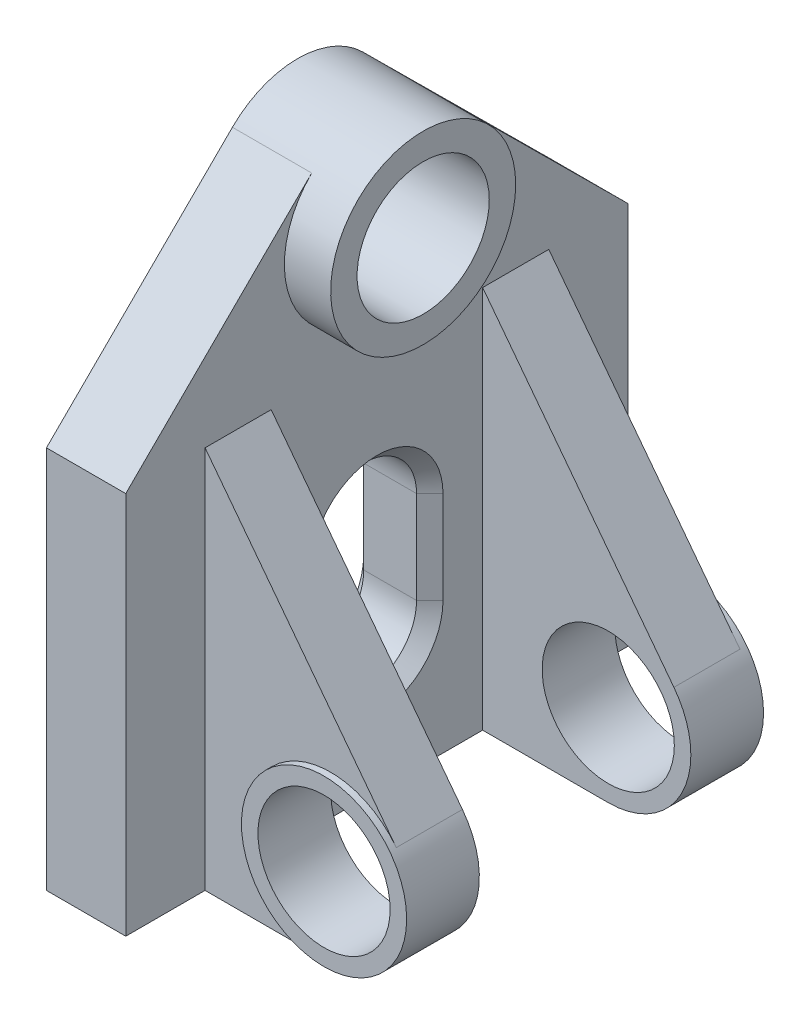
ISO-10303-21;
HEADER;
FILE_DESCRIPTION(('STEP AP214'),'2;1');
FILE_NAME('part.step','',(''),(''),'','','');
FILE_SCHEMA(('AUTOMOTIVE_DESIGN { 1 0 10303 214 1 1 1 1 }'));
ENDSEC;
DATA;
#1=APPLICATION_CONTEXT('core data for automotive mechanical design processes');
#2=APPLICATION_PROTOCOL_DEFINITION('international standard','automotive_design',2000,#1);
#3=PRODUCT_CONTEXT('',#1,'mechanical');
#4=PRODUCT('Part','Part','',(#3));
#5=PRODUCT_RELATED_PRODUCT_CATEGORY('part','',(#4));
#6=PRODUCT_DEFINITION_FORMATION('','',#4);
#7=PRODUCT_DEFINITION_CONTEXT('part definition',#1,'design');
#8=PRODUCT_DEFINITION('design','',#6,#7);
#9=PRODUCT_DEFINITION_SHAPE('','',#8);
#10=(LENGTH_UNIT() NAMED_UNIT(*) SI_UNIT(.MILLI.,.METRE.));
#11=(NAMED_UNIT(*) PLANE_ANGLE_UNIT() SI_UNIT($,.RADIAN.));
#12=(NAMED_UNIT(*) SI_UNIT($,.STERADIAN.) SOLID_ANGLE_UNIT());
#13=UNCERTAINTY_MEASURE_WITH_UNIT(LENGTH_MEASURE(1.E-05),#10,'distance_accuracy_value','');
#14=(GEOMETRIC_REPRESENTATION_CONTEXT(3) GLOBAL_UNCERTAINTY_ASSIGNED_CONTEXT((#13)) GLOBAL_UNIT_ASSIGNED_CONTEXT((#10,
#11,#12)) REPRESENTATION_CONTEXT('',''));
#15=CARTESIAN_POINT('',(0.,0.,0.));
#16=DIRECTION('',(0.,0.,1.));
#17=DIRECTION('',(1.,0.,0.));
#18=AXIS2_PLACEMENT_3D('',#15,#16,#17);
#19=CARTESIAN_POINT('',(12.,48.2075654717853,47.8629421342849));
#20=DIRECTION('',(0.,0.709638743055161,0.70456572039455));
#21=DIRECTION('',(0.,-0.70456572039455,0.709638743055161));
#22=AXIS2_PLACEMENT_3D('',#19,#20,#21);
#23=PLANE('',#22);
#24=DIRECTION('',(0.,0.70456572039455,-0.709638743055161));
#25=VECTOR('',#24,1.);
#26=CARTESIAN_POINT('',(0.,48.2075654717853,47.8629421342849));
#27=LINE('',#26,#25);
#28=CARTESIAN_POINT('',(0.,58.,38.));
#29=VERTEX_POINT('',#28);
#30=CARTESIAN_POINT('',(0.,85.9349424027723,9.8639200855237));
#31=VERTEX_POINT('',#30);
#32=EDGE_CURVE('E328',#29,#31,#27,.T.);
#33=ORIENTED_EDGE('',*,*,#32,.F.);
#34=DIRECTION('',(-1.,0.,0.));
#35=VECTOR('',#34,1.);
#36=CARTESIAN_POINT('',(12.,58.,38.));
#37=LINE('',#36,#35);
#38=CARTESIAN_POINT('',(12.,58.,38.));
#39=VERTEX_POINT('',#38);
#40=EDGE_CURVE('E394',#39,#29,#37,.T.);
#41=ORIENTED_EDGE('',*,*,#40,.F.);
#42=DIRECTION('',(0.,0.70456572039455,-0.709638743055161));
#43=VECTOR('',#42,1.);
#44=CARTESIAN_POINT('',(12.,48.2075654717853,47.8629421342849));
#45=LINE('',#44,#43);
#46=CARTESIAN_POINT('',(12.,85.9349424027723,9.8639200855237));
#47=VERTEX_POINT('',#46);
#48=EDGE_CURVE('E337',#39,#47,#45,.T.);
#49=ORIENTED_EDGE('',*,*,#48,.T.);
#50=DIRECTION('',(-1.,0.,0.));
#51=VECTOR('',#50,1.);
#52=CARTESIAN_POINT('',(12.,85.9349424027723,9.86392008552369));
#53=LINE('',#52,#51);
#54=EDGE_CURVE('E397',#47,#31,#53,.T.);
#55=ORIENTED_EDGE('',*,*,#54,.T.);
#56=EDGE_LOOP('',(#33,#41,#49,#55));
#57=FACE_BOUND('',#56,.T.);
#58=ADVANCED_FACE('F47',(#57),#23,.T.);
#59=CARTESIAN_POINT('',(12.,0.,38.));
#60=DIRECTION('',(0.,0.,1.));
#61=DIRECTION('',(1.,0.,0.));
#62=AXIS2_PLACEMENT_3D('',#59,#60,#61);
#63=PLANE('',#62);
#64=DIRECTION('',(0.,1.,0.));
#65=VECTOR('',#64,1.);
#66=CARTESIAN_POINT('',(0.,0.,38.));
#67=LINE('',#66,#65);
#68=CARTESIAN_POINT('',(0.,0.,38.));
#69=VERTEX_POINT('',#68);
#70=EDGE_CURVE('E364',#69,#29,#67,.T.);
#71=ORIENTED_EDGE('',*,*,#70,.F.);
#72=DIRECTION('',(-1.,0.,0.));
#73=VECTOR('',#72,1.);
#74=CARTESIAN_POINT('',(12.,0.,38.));
#75=LINE('',#74,#73);
#76=CARTESIAN_POINT('',(12.,0.,38.));
#77=VERTEX_POINT('',#76);
#78=EDGE_CURVE('E391',#77,#69,#75,.T.);
#79=ORIENTED_EDGE('',*,*,#78,.F.);
#80=DIRECTION('',(0.,1.,0.));
#81=VECTOR('',#80,1.);
#82=CARTESIAN_POINT('',(12.,0.,38.));
#83=LINE('',#82,#81);
#84=EDGE_CURVE('E342',#77,#39,#83,.T.);
#85=ORIENTED_EDGE('',*,*,#84,.T.);
#86=ORIENTED_EDGE('',*,*,#40,.T.);
#87=EDGE_LOOP('',(#71,#79,#85,#86));
#88=FACE_BOUND('',#87,.T.);
#89=ADVANCED_FACE('F557',(#88),#63,.T.);
#90=CARTESIAN_POINT('',(12.,0.,0.));
#91=DIRECTION('',(0.,1.,0.));
#92=DIRECTION('',(0.,0.,1.));
#93=AXIS2_PLACEMENT_3D('',#90,#91,#92);
#94=PLANE('',#93);
#95=DIRECTION('',(0.,0.,-1.));
#96=VECTOR('',#95,1.);
#97=CARTESIAN_POINT('',(0.,0.,0.));
#98=LINE('',#97,#96);
#99=CARTESIAN_POINT('',(0.,0.,-38.));
#100=VERTEX_POINT('',#99);
#101=EDGE_CURVE('E368',#69,#100,#98,.T.);
#102=ORIENTED_EDGE('',*,*,#101,.T.);
#103=DIRECTION('',(-1.,0.,0.));
#104=VECTOR('',#103,1.);
#105=CARTESIAN_POINT('',(12.,0.,-38.));
#106=LINE('',#105,#104);
#107=CARTESIAN_POINT('',(12.,0.,-38.));
#108=VERTEX_POINT('',#107);
#109=EDGE_CURVE('E387',#108,#100,#106,.T.);
#110=ORIENTED_EDGE('',*,*,#109,.F.);
#111=DIRECTION('',(0.,0.,-1.));
#112=VECTOR('',#111,1.);
#113=CARTESIAN_POINT('',(12.,0.,0.));
#114=LINE('',#113,#112);
#115=CARTESIAN_POINT('',(12.,0.,-26.));
#116=VERTEX_POINT('',#115);
#117=EDGE_CURVE('E346',#116,#108,#114,.T.);
#118=ORIENTED_EDGE('',*,*,#117,.F.);
#119=DIRECTION('',(1.,0.,0.));
#120=VECTOR('',#119,1.);
#121=CARTESIAN_POINT('',(0.,0.,-26.));
#122=LINE('',#121,#120);
#123=CARTESIAN_POINT('',(31.,0.,-26.));
#124=VERTEX_POINT('',#123);
#125=EDGE_CURVE('E220',#116,#124,#122,.T.);
#126=ORIENTED_EDGE('',*,*,#125,.T.);
#127=DIRECTION('',(0.,0.,1.));
#128=VECTOR('',#127,1.);
#129=CARTESIAN_POINT('',(31.,0.,-26.));
#130=LINE('',#129,#128);
#131=CARTESIAN_POINT('',(31.,0.,-16.));
#132=VERTEX_POINT('',#131);
#133=EDGE_CURVE('E216',#124,#132,#130,.T.);
#134=ORIENTED_EDGE('',*,*,#133,.T.);
#135=DIRECTION('',(1.,0.,0.));
#136=VECTOR('',#135,1.);
#137=CARTESIAN_POINT('',(0.,0.,-16.));
#138=LINE('',#137,#136);
#139=CARTESIAN_POINT('',(12.,0.,-16.));
#140=VERTEX_POINT('',#139);
#141=EDGE_CURVE('E200',#140,#132,#138,.T.);
#142=ORIENTED_EDGE('',*,*,#141,.F.);
#143=CARTESIAN_POINT('',(12.,0.,16.));
#144=VERTEX_POINT('',#143);
#145=EDGE_CURVE('E352',#144,#140,#114,.T.);
#146=ORIENTED_EDGE('',*,*,#145,.F.);
#147=DIRECTION('',(1.,0.,0.));
#148=VECTOR('',#147,1.);
#149=CARTESIAN_POINT('',(0.,0.,16.));
#150=LINE('',#149,#148);
#151=CARTESIAN_POINT('',(31.,0.,16.));
#152=VERTEX_POINT('',#151);
#153=EDGE_CURVE('E285',#144,#152,#150,.T.);
#154=ORIENTED_EDGE('',*,*,#153,.T.);
#155=DIRECTION('',(0.,0.,-1.));
#156=VECTOR('',#155,1.);
#157=CARTESIAN_POINT('',(31.,0.,26.));
#158=LINE('',#157,#156);
#159=CARTESIAN_POINT('',(31.,0.,26.));
#160=VERTEX_POINT('',#159);
#161=EDGE_CURVE('E296',#160,#152,#158,.T.);
#162=ORIENTED_EDGE('',*,*,#161,.F.);
#163=DIRECTION('',(1.,0.,0.));
#164=VECTOR('',#163,1.);
#165=CARTESIAN_POINT('',(0.,0.,26.));
#166=LINE('',#165,#164);
#167=CARTESIAN_POINT('',(12.,0.,26.));
#168=VERTEX_POINT('',#167);
#169=EDGE_CURVE('E292',#168,#160,#166,.T.);
#170=ORIENTED_EDGE('',*,*,#169,.F.);
#171=EDGE_CURVE('E347',#77,#168,#114,.T.);
#172=ORIENTED_EDGE('',*,*,#171,.F.);
#173=ORIENTED_EDGE('',*,*,#78,.T.);
#174=EDGE_LOOP('',(#102,#110,#118,#126,#134,#142,#146,#154,#162,#170,#172,#173));
#175=FACE_BOUND('',#174,.T.);
#176=ADVANCED_FACE('F218',(#175),#94,.F.);
#177=CARTESIAN_POINT('',(12.,0.,-38.));
#178=DIRECTION('',(0.,0.,1.));
#179=DIRECTION('',(1.,0.,0.));
#180=AXIS2_PLACEMENT_3D('',#177,#178,#179);
#181=PLANE('',#180);
#182=DIRECTION('',(0.,1.,0.));
#183=VECTOR('',#182,1.);
#184=CARTESIAN_POINT('',(0.,0.,-38.));
#185=LINE('',#184,#183);
#186=CARTESIAN_POINT('',(0.,58.,-38.));
#187=VERTEX_POINT('',#186);
#188=EDGE_CURVE('E371',#100,#187,#185,.T.);
#189=ORIENTED_EDGE('',*,*,#188,.T.);
#190=DIRECTION('',(-1.,0.,0.));
#191=VECTOR('',#190,1.);
#192=CARTESIAN_POINT('',(12.,58.,-38.));
#193=LINE('',#192,#191);
#194=CARTESIAN_POINT('',(12.,58.,-38.));
#195=VERTEX_POINT('',#194);
#196=EDGE_CURVE('E382',#195,#187,#193,.T.);
#197=ORIENTED_EDGE('',*,*,#196,.F.);
#198=DIRECTION('',(0.,1.,0.));
#199=VECTOR('',#198,1.);
#200=CARTESIAN_POINT('',(12.,0.,-38.));
#201=LINE('',#200,#199);
#202=EDGE_CURVE('E351',#108,#195,#201,.T.);
#203=ORIENTED_EDGE('',*,*,#202,.F.);
#204=ORIENTED_EDGE('',*,*,#109,.T.);
#205=EDGE_LOOP('',(#189,#197,#203,#204));
#206=FACE_BOUND('',#205,.T.);
#207=ADVANCED_FACE('F576',(#206),#181,.F.);
#208=CARTESIAN_POINT('',(12.,20.,0.));
#209=DIRECTION('',(-1.,0.,0.));
#210=DIRECTION('',(0.,0.,1.));
#211=AXIS2_PLACEMENT_3D('',#208,#209,#210);
#212=CYLINDRICAL_SURFACE('',#211,8.);
#213=DIRECTION('',(-1.,0.,0.));
#214=VECTOR('',#213,1.);
#215=CARTESIAN_POINT('',(12.,20.,-8.));
#216=LINE('',#215,#214);
#217=CARTESIAN_POINT('',(10.,20.,-8.));
#218=VERTEX_POINT('',#217);
#219=CARTESIAN_POINT('',(2.,20.,-8.));
#220=VERTEX_POINT('',#219);
#221=EDGE_CURVE('E360',#218,#220,#216,.T.);
#222=ORIENTED_EDGE('',*,*,#221,.T.);
#223=CARTESIAN_POINT('',(2.,20.,0.));
#224=DIRECTION('',(1.,0.,0.));
#225=DIRECTION('',(0.,0.,-1.));
#226=AXIS2_PLACEMENT_3D('',#223,#224,#225);
#227=CIRCLE('',#226,8.);
#228=CARTESIAN_POINT('',(2.,20.,8.));
#229=VERTEX_POINT('',#228);
#230=EDGE_CURVE('E445',#220,#229,#227,.F.);
#231=ORIENTED_EDGE('',*,*,#230,.T.);
#232=DIRECTION('',(-1.,0.,0.));
#233=VECTOR('',#232,1.);
#234=CARTESIAN_POINT('',(12.,20.,8.));
#235=LINE('',#234,#233);
#236=CARTESIAN_POINT('',(10.,20.,8.));
#237=VERTEX_POINT('',#236);
#238=EDGE_CURVE('E383',#237,#229,#235,.T.);
#239=ORIENTED_EDGE('',*,*,#238,.F.);
#240=CARTESIAN_POINT('',(10.,20.,0.));
#241=DIRECTION('',(1.,0.,0.));
#242=DIRECTION('',(0.,0.,-1.));
#243=AXIS2_PLACEMENT_3D('',#240,#241,#242);
#244=CIRCLE('',#243,8.);
#245=EDGE_CURVE('E442',#237,#218,#244,.T.);
#246=ORIENTED_EDGE('',*,*,#245,.T.);
#247=EDGE_LOOP('',(#222,#231,#239,#246));
#248=FACE_BOUND('',#247,.T.);
#249=ADVANCED_FACE('F523',(#248),#212,.F.);
#250=CARTESIAN_POINT('',(12.,0.,8.00000000000001));
#251=DIRECTION('',(0.,0.,-1.));
#252=DIRECTION('',(0.,1.,0.));
#253=AXIS2_PLACEMENT_3D('',#250,#251,#252);
#254=PLANE('',#253);
#255=ORIENTED_EDGE('',*,*,#238,.T.);
#256=DIRECTION('',(0.,1.,0.));
#257=VECTOR('',#256,1.);
#258=CARTESIAN_POINT('',(2.,34.,8.));
#259=LINE('',#258,#257);
#260=CARTESIAN_POINT('',(2.,34.,8.));
#261=VERTEX_POINT('',#260);
#262=EDGE_CURVE('E451',#229,#261,#259,.T.);
#263=ORIENTED_EDGE('',*,*,#262,.T.);
#264=DIRECTION('',(-1.,0.,0.));
#265=VECTOR('',#264,1.);
#266=CARTESIAN_POINT('',(12.,34.,8.));
#267=LINE('',#266,#265);
#268=CARTESIAN_POINT('',(10.,34.,8.));
#269=VERTEX_POINT('',#268);
#270=EDGE_CURVE('E409',#269,#261,#267,.T.);
#271=ORIENTED_EDGE('',*,*,#270,.F.);
#272=DIRECTION('',(0.,-1.,0.));
#273=VECTOR('',#272,1.);
#274=CARTESIAN_POINT('',(10.,0.,8.00000000000001));
#275=LINE('',#274,#273);
#276=EDGE_CURVE('E448',#269,#237,#275,.T.);
#277=ORIENTED_EDGE('',*,*,#276,.T.);
#278=EDGE_LOOP('',(#255,#263,#271,#277));
#279=FACE_BOUND('',#278,.T.);
#280=ADVANCED_FACE('F506',(#279),#254,.T.);
#281=CARTESIAN_POINT('',(12.,34.,0.));
#282=DIRECTION('',(-1.,0.,0.));
#283=DIRECTION('',(0.,0.,1.));
#284=AXIS2_PLACEMENT_3D('',#281,#282,#283);
#285=CYLINDRICAL_SURFACE('',#284,8.);
#286=ORIENTED_EDGE('',*,*,#270,.T.);
#287=CARTESIAN_POINT('',(2.,34.,0.));
#288=DIRECTION('',(1.,0.,0.));
#289=DIRECTION('',(0.,0.,-1.));
#290=AXIS2_PLACEMENT_3D('',#287,#288,#289);
#291=CIRCLE('',#290,8.);
#292=CARTESIAN_POINT('',(2.,34.,-8.));
#293=VERTEX_POINT('',#292);
#294=EDGE_CURVE('E432',#261,#293,#291,.F.);
#295=ORIENTED_EDGE('',*,*,#294,.T.);
#296=DIRECTION('',(-1.,0.,0.));
#297=VECTOR('',#296,1.);
#298=CARTESIAN_POINT('',(12.,34.,-8.));
#299=LINE('',#298,#297);
#300=CARTESIAN_POINT('',(10.,34.,-8.));
#301=VERTEX_POINT('',#300);
#302=EDGE_CURVE('E405',#301,#293,#299,.T.);
#303=ORIENTED_EDGE('',*,*,#302,.F.);
#304=CARTESIAN_POINT('',(10.,34.,0.));
#305=DIRECTION('',(1.,0.,0.));
#306=DIRECTION('',(0.,0.,-1.));
#307=AXIS2_PLACEMENT_3D('',#304,#305,#306);
#308=CIRCLE('',#307,8.);
#309=EDGE_CURVE('E428',#301,#269,#308,.T.);
#310=ORIENTED_EDGE('',*,*,#309,.T.);
#311=EDGE_LOOP('',(#286,#295,#303,#310));
#312=FACE_BOUND('',#311,.T.);
#313=ADVANCED_FACE('F504',(#312),#285,.F.);
#314=CARTESIAN_POINT('',(12.,0.,-8.00000000000001));
#315=DIRECTION('',(0.,0.,-1.));
#316=DIRECTION('',(0.,1.,0.));
#317=AXIS2_PLACEMENT_3D('',#314,#315,#316);
#318=PLANE('',#317);
#319=ORIENTED_EDGE('',*,*,#302,.T.);
#320=DIRECTION('',(0.,-1.,0.));
#321=VECTOR('',#320,1.);
#322=CARTESIAN_POINT('',(2.,0.,-8.00000000000001));
#323=LINE('',#322,#321);
#324=EDGE_CURVE('E439',#293,#220,#323,.T.);
#325=ORIENTED_EDGE('',*,*,#324,.T.);
#326=ORIENTED_EDGE('',*,*,#221,.F.);
#327=DIRECTION('',(0.,1.,0.));
#328=VECTOR('',#327,1.);
#329=CARTESIAN_POINT('',(10.,34.,-8.));
#330=LINE('',#329,#328);
#331=EDGE_CURVE('E436',#218,#301,#330,.T.);
#332=ORIENTED_EDGE('',*,*,#331,.T.);
#333=EDGE_LOOP('',(#319,#325,#326,#332));
#334=FACE_BOUND('',#333,.T.);
#335=ADVANCED_FACE('F519',(#334),#318,.F.);
#336=CARTESIAN_POINT('',(12.,48.2075654717853,-47.8629421342849));
#337=DIRECTION('',(0.,-0.709638743055161,0.70456572039455));
#338=DIRECTION('',(0.,-0.70456572039455,-0.709638743055161));
#339=AXIS2_PLACEMENT_3D('',#336,#337,#338);
#340=PLANE('',#339);
#341=DIRECTION('',(0.,0.70456572039455,0.709638743055161));
#342=VECTOR('',#341,1.);
#343=CARTESIAN_POINT('',(0.,48.2075654717853,-47.8629421342849));
#344=LINE('',#343,#342);
#345=CARTESIAN_POINT('',(0.,85.9349424027723,-9.86392008552369));
#346=VERTEX_POINT('',#345);
#347=EDGE_CURVE('E338',#187,#346,#344,.T.);
#348=ORIENTED_EDGE('',*,*,#347,.T.);
#349=DIRECTION('',(-1.,0.,0.));
#350=VECTOR('',#349,1.);
#351=CARTESIAN_POINT('',(12.,85.9349424027723,-9.86392008552369));
#352=LINE('',#351,#350);
#353=CARTESIAN_POINT('',(12.,85.9349424027723,-9.8639200855237));
#354=VERTEX_POINT('',#353);
#355=EDGE_CURVE('E378',#354,#346,#352,.T.);
#356=ORIENTED_EDGE('',*,*,#355,.F.);
#357=DIRECTION('',(0.,0.70456572039455,0.709638743055161));
#358=VECTOR('',#357,1.);
#359=CARTESIAN_POINT('',(12.,48.2075654717853,-47.8629421342849));
#360=LINE('',#359,#358);
#361=EDGE_CURVE('E356',#195,#354,#360,.T.);
#362=ORIENTED_EDGE('',*,*,#361,.F.);
#363=ORIENTED_EDGE('',*,*,#196,.T.);
#364=EDGE_LOOP('',(#348,#356,#362,#363));
#365=FACE_BOUND('',#364,.T.);
#366=ADVANCED_FACE('F569',(#365),#340,.F.);
#367=CARTESIAN_POINT('',(12.,0.,0.));
#368=DIRECTION('',(1.,0.,0.));
#369=DIRECTION('',(0.,0.,-1.));
#370=AXIS2_PLACEMENT_3D('',#367,#368,#369);
#371=PLANE('',#370);
#372=DIRECTION('',(0.,1.,0.));
#373=VECTOR('',#372,1.);
#374=CARTESIAN_POINT('',(12.,0.,10.));
#375=LINE('',#374,#373);
#376=CARTESIAN_POINT('',(12.,20.,10.));
#377=VERTEX_POINT('',#376);
#378=CARTESIAN_POINT('',(12.,34.,10.));
#379=VERTEX_POINT('',#378);
#380=EDGE_CURVE('E58',#377,#379,#375,.T.);
#381=ORIENTED_EDGE('',*,*,#380,.T.);
#382=CARTESIAN_POINT('',(12.,34.,0.));
#383=DIRECTION('',(1.,0.,0.));
#384=DIRECTION('',(0.,0.,-1.));
#385=AXIS2_PLACEMENT_3D('',#382,#383,#384);
#386=CIRCLE('',#385,10.);
#387=CARTESIAN_POINT('',(12.,34.,-10.));
#388=VERTEX_POINT('',#387);
#389=EDGE_CURVE('E11',#379,#388,#386,.F.);
#390=ORIENTED_EDGE('',*,*,#389,.T.);
#391=DIRECTION('',(0.,-1.,0.));
#392=VECTOR('',#391,1.);
#393=CARTESIAN_POINT('',(12.,20.,-10.));
#394=LINE('',#393,#392);
#395=CARTESIAN_POINT('',(12.,20.,-10.));
#396=VERTEX_POINT('',#395);
#397=EDGE_CURVE('E457',#388,#396,#394,.T.);
#398=ORIENTED_EDGE('',*,*,#397,.T.);
#399=CARTESIAN_POINT('',(12.,20.,0.));
#400=DIRECTION('',(1.,0.,0.));
#401=DIRECTION('',(0.,0.,-1.));
#402=AXIS2_PLACEMENT_3D('',#399,#400,#401);
#403=CIRCLE('',#402,10.);
#404=EDGE_CURVE('E454',#396,#377,#403,.F.);
#405=ORIENTED_EDGE('',*,*,#404,.T.);
#406=EDGE_LOOP('',(#381,#390,#398,#405));
#407=FACE_BOUND('',#406,.T.);
#408=DIRECTION('',(0.,-1.,0.));
#409=VECTOR('',#408,1.);
#410=CARTESIAN_POINT('',(12.,0.,-26.));
#411=LINE('',#410,#409);
#412=CARTESIAN_POINT('',(12.,58.,-26.));
#413=VERTEX_POINT('',#412);
#414=EDGE_CURVE('E250',#413,#116,#411,.T.);
#415=ORIENTED_EDGE('',*,*,#414,.T.);
#416=ORIENTED_EDGE('',*,*,#117,.T.);
#417=ORIENTED_EDGE('',*,*,#202,.T.);
#418=ORIENTED_EDGE('',*,*,#361,.T.);
#419=CARTESIAN_POINT('',(12.,76.,0.));
#420=DIRECTION('',(1.,0.,0.));
#421=DIRECTION('',(0.,0.,-1.));
#422=AXIS2_PLACEMENT_3D('',#419,#420,#421);
#423=CIRCLE('',#422,14.);
#424=EDGE_CURVE('E334',#47,#354,#423,.T.);
#425=ORIENTED_EDGE('',*,*,#424,.F.);
#426=ORIENTED_EDGE('',*,*,#48,.F.);
#427=ORIENTED_EDGE('',*,*,#84,.F.);
#428=ORIENTED_EDGE('',*,*,#171,.T.);
#429=DIRECTION('',(0.,-1.,0.));
#430=VECTOR('',#429,1.);
#431=CARTESIAN_POINT('',(12.,0.,26.));
#432=LINE('',#431,#430);
#433=CARTESIAN_POINT('',(12.,58.,26.));
#434=VERTEX_POINT('',#433);
#435=EDGE_CURVE('E289',#434,#168,#432,.T.);
#436=ORIENTED_EDGE('',*,*,#435,.F.);
#437=DIRECTION('',(0.,0.,-1.));
#438=VECTOR('',#437,1.);
#439=CARTESIAN_POINT('',(12.,58.,26.));
#440=LINE('',#439,#438);
#441=CARTESIAN_POINT('',(12.,58.,16.));
#442=VERTEX_POINT('',#441);
#443=EDGE_CURVE('E310',#434,#442,#440,.T.);
#444=ORIENTED_EDGE('',*,*,#443,.T.);
#445=DIRECTION('',(0.,-1.,0.));
#446=VECTOR('',#445,1.);
#447=CARTESIAN_POINT('',(12.,0.,16.));
#448=LINE('',#447,#446);
#449=EDGE_CURVE('E300',#442,#144,#448,.T.);
#450=ORIENTED_EDGE('',*,*,#449,.T.);
#451=ORIENTED_EDGE('',*,*,#145,.T.);
#452=DIRECTION('',(0.,-1.,0.));
#453=VECTOR('',#452,1.);
#454=CARTESIAN_POINT('',(12.,0.,-16.));
#455=LINE('',#454,#453);
#456=CARTESIAN_POINT('',(12.,58.,-16.));
#457=VERTEX_POINT('',#456);
#458=EDGE_CURVE('E207',#457,#140,#455,.T.);
#459=ORIENTED_EDGE('',*,*,#458,.F.);
#460=DIRECTION('',(0.,0.,1.));
#461=VECTOR('',#460,1.);
#462=CARTESIAN_POINT('',(12.,58.,-26.));
#463=LINE('',#462,#461);
#464=EDGE_CURVE('E225',#413,#457,#463,.T.);
#465=ORIENTED_EDGE('',*,*,#464,.F.);
#466=EDGE_LOOP('',(#415,#416,#417,#418,#425,#426,#427,#428,#436,#444,#450,#451,#459,#465));
#467=FACE_BOUND('',#466,.T.);
#468=ADVANCED_FACE('F494',(#407,#467),#371,.T.);
#469=CARTESIAN_POINT('',(0.,0.,0.));
#470=DIRECTION('',(1.,0.,0.));
#471=DIRECTION('',(0.,0.,-1.));
#472=AXIS2_PLACEMENT_3D('',#469,#470,#471);
#473=PLANE('',#472);
#474=DIRECTION('',(0.,1.,0.));
#475=VECTOR('',#474,1.);
#476=CARTESIAN_POINT('',(0.,0.,-10.));
#477=LINE('',#476,#475);
#478=CARTESIAN_POINT('',(0.,20.,-9.99999999999999));
#479=VERTEX_POINT('',#478);
#480=CARTESIAN_POINT('',(0.,34.,-9.99999999999999));
#481=VERTEX_POINT('',#480);
#482=EDGE_CURVE('E421',#479,#481,#477,.T.);
#483=ORIENTED_EDGE('',*,*,#482,.T.);
#484=CARTESIAN_POINT('',(0.,34.,0.));
#485=DIRECTION('',(1.,0.,0.));
#486=DIRECTION('',(0.,0.,-1.));
#487=AXIS2_PLACEMENT_3D('',#484,#485,#486);
#488=CIRCLE('',#487,9.99999999999999);
#489=CARTESIAN_POINT('',(0.,34.,9.99999999999999));
#490=VERTEX_POINT('',#489);
#491=EDGE_CURVE('E424',#481,#490,#488,.T.);
#492=ORIENTED_EDGE('',*,*,#491,.T.);
#493=DIRECTION('',(0.,-1.,0.));
#494=VECTOR('',#493,1.);
#495=CARTESIAN_POINT('',(0.,20.,9.99999999999999));
#496=LINE('',#495,#494);
#497=CARTESIAN_POINT('',(0.,20.,9.99999999999999));
#498=VERTEX_POINT('',#497);
#499=EDGE_CURVE('E401',#490,#498,#496,.T.);
#500=ORIENTED_EDGE('',*,*,#499,.T.);
#501=CARTESIAN_POINT('',(0.,20.,0.));
#502=DIRECTION('',(1.,0.,0.));
#503=DIRECTION('',(0.,0.,-1.));
#504=AXIS2_PLACEMENT_3D('',#501,#502,#503);
#505=CIRCLE('',#504,9.99999999999999);
#506=EDGE_CURVE('E418',#498,#479,#505,.T.);
#507=ORIENTED_EDGE('',*,*,#506,.T.);
#508=EDGE_LOOP('',(#483,#492,#500,#507));
#509=FACE_BOUND('',#508,.T.);
#510=ORIENTED_EDGE('',*,*,#32,.T.);
#511=CARTESIAN_POINT('',(0.,76.,0.));
#512=DIRECTION('',(1.,0.,0.));
#513=DIRECTION('',(0.,0.,-1.));
#514=AXIS2_PLACEMENT_3D('',#511,#512,#513);
#515=CIRCLE('',#514,14.);
#516=EDGE_CURVE('E324',#346,#31,#515,.T.);
#517=ORIENTED_EDGE('',*,*,#516,.F.);
#518=ORIENTED_EDGE('',*,*,#347,.F.);
#519=ORIENTED_EDGE('',*,*,#188,.F.);
#520=ORIENTED_EDGE('',*,*,#101,.F.);
#521=ORIENTED_EDGE('',*,*,#70,.T.);
#522=EDGE_LOOP('',(#510,#517,#518,#519,#520,#521));
#523=FACE_BOUND('',#522,.T.);
#524=CARTESIAN_POINT('',(0.,76.,0.));
#525=DIRECTION('',(1.,0.,0.));
#526=DIRECTION('',(0.,0.,-1.));
#527=AXIS2_PLACEMENT_3D('',#524,#525,#526);
#528=CIRCLE('',#527,10.);
#529=CARTESIAN_POINT('',(0.,76.,-10.));
#530=VERTEX_POINT('',#529);
#531=EDGE_CURVE('E318',#530,#530,#528,.T.);
#532=ORIENTED_EDGE('',*,*,#531,.T.);
#533=EDGE_LOOP('',(#532));
#534=FACE_BOUND('',#533,.T.);
#535=ADVANCED_FACE('F532',(#509,#523,#534),#473,.F.);
#536=CARTESIAN_POINT('',(19.,76.,0.));
#537=DIRECTION('',(-1.,0.,0.));
#538=DIRECTION('',(0.,0.,1.));
#539=AXIS2_PLACEMENT_3D('',#536,#537,#538);
#540=CYLINDRICAL_SURFACE('',#539,14.);
#541=CARTESIAN_POINT('',(19.,76.,0.));
#542=DIRECTION('',(1.,0.,0.));
#543=DIRECTION('',(0.,0.,-1.));
#544=AXIS2_PLACEMENT_3D('',#541,#542,#543);
#545=CIRCLE('',#544,14.);
#546=CARTESIAN_POINT('',(19.,76.,-14.));
#547=VERTEX_POINT('',#546);
#548=EDGE_CURVE('E323',#547,#547,#545,.T.);
#549=ORIENTED_EDGE('',*,*,#548,.F.);
#550=EDGE_LOOP('',(#549));
#551=FACE_BOUND('',#550,.T.);
#552=ORIENTED_EDGE('',*,*,#516,.T.);
#553=ORIENTED_EDGE('',*,*,#54,.F.);
#554=ORIENTED_EDGE('',*,*,#424,.T.);
#555=ORIENTED_EDGE('',*,*,#355,.T.);
#556=EDGE_LOOP('',(#552,#553,#554,#555));
#557=FACE_BOUND('',#556,.T.);
#558=ADVANCED_FACE('F535',(#551,#557),#540,.T.);
#559=CARTESIAN_POINT('',(19.,76.,0.));
#560=DIRECTION('',(-1.,0.,0.));
#561=DIRECTION('',(0.,0.,1.));
#562=AXIS2_PLACEMENT_3D('',#559,#560,#561);
#563=CYLINDRICAL_SURFACE('',#562,10.);
#564=CARTESIAN_POINT('',(19.,76.,0.));
#565=DIRECTION('',(1.,0.,0.));
#566=DIRECTION('',(0.,0.,-1.));
#567=AXIS2_PLACEMENT_3D('',#564,#565,#566);
#568=CIRCLE('',#567,10.);
#569=CARTESIAN_POINT('',(19.,76.,-10.));
#570=VERTEX_POINT('',#569);
#571=EDGE_CURVE('E319',#570,#570,#568,.T.);
#572=ORIENTED_EDGE('',*,*,#571,.T.);
#573=EDGE_LOOP('',(#572));
#574=FACE_BOUND('',#573,.T.);
#575=ORIENTED_EDGE('',*,*,#531,.F.);
#576=EDGE_LOOP('',(#575));
#577=FACE_BOUND('',#576,.T.);
#578=ADVANCED_FACE('F541',(#574,#577),#563,.F.);
#579=CARTESIAN_POINT('',(19.,0.,0.));
#580=DIRECTION('',(1.,0.,0.));
#581=DIRECTION('',(0.,0.,-1.));
#582=AXIS2_PLACEMENT_3D('',#579,#580,#581);
#583=PLANE('',#582);
#584=ORIENTED_EDGE('',*,*,#571,.F.);
#585=EDGE_LOOP('',(#584));
#586=FACE_BOUND('',#585,.T.);
#587=ORIENTED_EDGE('',*,*,#548,.T.);
#588=EDGE_LOOP('',(#587));
#589=FACE_BOUND('',#588,.T.);
#590=ADVANCED_FACE('F543',(#586,#589),#583,.T.);
#591=CARTESIAN_POINT('',(35.5553952818469,27.1348968570662,26.));
#592=DIRECTION('',(0.794945679474983,0.606680613407136,0.));
#593=DIRECTION('',(-0.606680613407136,0.794945679474983,0.));
#594=AXIS2_PLACEMENT_3D('',#591,#592,#593);
#595=PLANE('',#594);
#596=DIRECTION('',(0.606680613407136,-0.794945679474983,0.));
#597=VECTOR('',#596,1.);
#598=CARTESIAN_POINT('',(35.5553952818469,27.1348968570662,16.));
#599=LINE('',#598,#597);
#600=CARTESIAN_POINT('',(40.9368209934373,20.0835076675892,16.));
#601=VERTEX_POINT('',#600);
#602=EDGE_CURVE('E275',#442,#601,#599,.T.);
#603=ORIENTED_EDGE('',*,*,#602,.F.);
#604=ORIENTED_EDGE('',*,*,#443,.F.);
#605=DIRECTION('',(0.606680613407136,-0.794945679474983,0.));
#606=VECTOR('',#605,1.);
#607=CARTESIAN_POINT('',(35.5553952818469,27.1348968570662,26.));
#608=LINE('',#607,#606);
#609=CARTESIAN_POINT('',(40.9368209934373,20.0835076675892,26.));
#610=VERTEX_POINT('',#609);
#611=EDGE_CURVE('E284',#434,#610,#608,.T.);
#612=ORIENTED_EDGE('',*,*,#611,.T.);
#613=DIRECTION('',(0.,0.,-1.));
#614=VECTOR('',#613,1.);
#615=CARTESIAN_POINT('',(40.9368209934373,20.0835076675892,26.));
#616=LINE('',#615,#614);
#617=EDGE_CURVE('E314',#610,#601,#616,.T.);
#618=ORIENTED_EDGE('',*,*,#617,.T.);
#619=EDGE_LOOP('',(#603,#604,#612,#618));
#620=FACE_BOUND('',#619,.T.);
#621=ADVANCED_FACE('F550',(#620),#595,.T.);
#622=CARTESIAN_POINT('',(0.,0.,26.));
#623=DIRECTION('',(0.,0.,1.));
#624=DIRECTION('',(1.,0.,0.));
#625=AXIS2_PLACEMENT_3D('',#622,#623,#624);
#626=PLANE('',#625);
#627=CARTESIAN_POINT('',(31.,12.5,26.));
#628=DIRECTION('',(0.,0.,1.));
#629=DIRECTION('',(1.,0.,0.));
#630=AXIS2_PLACEMENT_3D('',#627,#628,#629);
#631=CIRCLE('',#630,12.5);
#632=EDGE_CURVE('E281',#610,#160,#631,.T.);
#633=ORIENTED_EDGE('',*,*,#632,.F.);
#634=ORIENTED_EDGE('',*,*,#611,.F.);
#635=ORIENTED_EDGE('',*,*,#435,.T.);
#636=ORIENTED_EDGE('',*,*,#169,.T.);
#637=EDGE_LOOP('',(#633,#634,#635,#636));
#638=FACE_BOUND('',#637,.T.);
#639=ADVANCED_FACE('F710',(#638),#626,.T.);
#640=CARTESIAN_POINT('',(0.,0.,16.));
#641=DIRECTION('',(0.,0.,1.));
#642=DIRECTION('',(1.,0.,0.));
#643=AXIS2_PLACEMENT_3D('',#640,#641,#642);
#644=PLANE('',#643);
#645=ORIENTED_EDGE('',*,*,#602,.T.);
#646=CARTESIAN_POINT('',(31.,12.5,16.));
#647=DIRECTION('',(0.,0.,1.));
#648=DIRECTION('',(1.,0.,0.));
#649=AXIS2_PLACEMENT_3D('',#646,#647,#648);
#650=CIRCLE('',#649,12.5);
#651=EDGE_CURVE('E271',#152,#601,#650,.T.);
#652=ORIENTED_EDGE('',*,*,#651,.F.);
#653=ORIENTED_EDGE('',*,*,#153,.F.);
#654=ORIENTED_EDGE('',*,*,#449,.F.);
#655=EDGE_LOOP('',(#645,#652,#653,#654));
#656=FACE_BOUND('',#655,.T.);
#657=CARTESIAN_POINT('',(31.,12.5,16.));
#658=DIRECTION('',(0.,0.,1.));
#659=DIRECTION('',(1.,0.,0.));
#660=AXIS2_PLACEMENT_3D('',#657,#658,#659);
#661=CIRCLE('',#660,9.99999999999999);
#662=CARTESIAN_POINT('',(41.,12.5,16.));
#663=VERTEX_POINT('',#662);
#664=EDGE_CURVE('E224',#663,#663,#661,.T.);
#665=ORIENTED_EDGE('',*,*,#664,.T.);
#666=EDGE_LOOP('',(#665));
#667=FACE_BOUND('',#666,.T.);
#668=ADVANCED_FACE('F702',(#656,#667),#644,.F.);
#669=CARTESIAN_POINT('',(31.,12.5,27.));
#670=DIRECTION('',(0.,0.,-1.));
#671=DIRECTION('',(-1.,0.,0.));
#672=AXIS2_PLACEMENT_3D('',#669,#670,#671);
#673=CYLINDRICAL_SURFACE('',#672,9.99999999999999);
#674=CARTESIAN_POINT('',(31.,12.5,27.));
#675=DIRECTION('',(0.,0.,1.));
#676=DIRECTION('',(1.,0.,0.));
#677=AXIS2_PLACEMENT_3D('',#674,#675,#676);
#678=CIRCLE('',#677,9.99999999999999);
#679=CARTESIAN_POINT('',(41.,12.5,27.));
#680=VERTEX_POINT('',#679);
#681=EDGE_CURVE('E266',#680,#680,#678,.T.);
#682=ORIENTED_EDGE('',*,*,#681,.T.);
#683=EDGE_LOOP('',(#682));
#684=FACE_BOUND('',#683,.T.);
#685=ORIENTED_EDGE('',*,*,#664,.F.);
#686=EDGE_LOOP('',(#685));
#687=FACE_BOUND('',#686,.T.);
#688=ADVANCED_FACE('F694',(#684,#687),#673,.F.);
#689=CARTESIAN_POINT('',(31.,12.5,27.));
#690=DIRECTION('',(0.,0.,-1.));
#691=DIRECTION('',(-1.,0.,0.));
#692=AXIS2_PLACEMENT_3D('',#689,#690,#691);
#693=CYLINDRICAL_SURFACE('',#692,12.5);
#694=ORIENTED_EDGE('',*,*,#161,.T.);
#695=ORIENTED_EDGE('',*,*,#651,.T.);
#696=ORIENTED_EDGE('',*,*,#617,.F.);
#697=ORIENTED_EDGE('',*,*,#632,.T.);
#698=EDGE_LOOP('',(#694,#695,#696,#697));
#699=FACE_BOUND('',#698,.T.);
#700=CARTESIAN_POINT('',(31.,12.5,27.));
#701=DIRECTION('',(0.,0.,1.));
#702=DIRECTION('',(1.,0.,0.));
#703=AXIS2_PLACEMENT_3D('',#700,#701,#702);
#704=CIRCLE('',#703,12.5);
#705=CARTESIAN_POINT('',(43.5,12.5,27.));
#706=VERTEX_POINT('',#705);
#707=EDGE_CURVE('E270',#706,#706,#704,.T.);
#708=ORIENTED_EDGE('',*,*,#707,.F.);
#709=EDGE_LOOP('',(#708));
#710=FACE_BOUND('',#709,.T.);
#711=ADVANCED_FACE('F686',(#699,#710),#693,.T.);
#712=CARTESIAN_POINT('',(0.,0.,27.));
#713=DIRECTION('',(0.,0.,1.));
#714=DIRECTION('',(1.,0.,0.));
#715=AXIS2_PLACEMENT_3D('',#712,#713,#714);
#716=PLANE('',#715);
#717=ORIENTED_EDGE('',*,*,#681,.F.);
#718=EDGE_LOOP('',(#717));
#719=FACE_BOUND('',#718,.T.);
#720=ORIENTED_EDGE('',*,*,#707,.T.);
#721=EDGE_LOOP('',(#720));
#722=FACE_BOUND('',#721,.T.);
#723=ADVANCED_FACE('F677',(#719,#722),#716,.T.);
#724=CARTESIAN_POINT('',(35.5553952818469,27.1348968570662,-26.));
#725=DIRECTION('',(-0.794945679474983,-0.606680613407136,0.));
#726=DIRECTION('',(0.606680613407136,-0.794945679474983,0.));
#727=AXIS2_PLACEMENT_3D('',#724,#725,#726);
#728=PLANE('',#727);
#729=DIRECTION('',(0.606680613407136,-0.794945679474983,0.));
#730=VECTOR('',#729,1.);
#731=CARTESIAN_POINT('',(35.5553952818469,27.1348968570662,-16.));
#732=LINE('',#731,#730);
#733=CARTESIAN_POINT('',(40.9368209934373,20.0835076675892,-16.));
#734=VERTEX_POINT('',#733);
#735=EDGE_CURVE('E247',#457,#734,#732,.T.);
#736=ORIENTED_EDGE('',*,*,#735,.T.);
#737=DIRECTION('',(0.,0.,1.));
#738=VECTOR('',#737,1.);
#739=CARTESIAN_POINT('',(40.9368209934373,20.0835076675892,-26.));
#740=LINE('',#739,#738);
#741=CARTESIAN_POINT('',(40.9368209934373,20.0835076675892,-26.));
#742=VERTEX_POINT('',#741);
#743=EDGE_CURVE('E230',#742,#734,#740,.T.);
#744=ORIENTED_EDGE('',*,*,#743,.F.);
#745=DIRECTION('',(0.606680613407136,-0.794945679474983,0.));
#746=VECTOR('',#745,1.);
#747=CARTESIAN_POINT('',(35.5553952818469,27.1348968570662,-26.));
#748=LINE('',#747,#746);
#749=EDGE_CURVE('E254',#413,#742,#748,.T.);
#750=ORIENTED_EDGE('',*,*,#749,.F.);
#751=ORIENTED_EDGE('',*,*,#464,.T.);
#752=EDGE_LOOP('',(#736,#744,#750,#751));
#753=FACE_BOUND('',#752,.T.);
#754=ADVANCED_FACE('F669',(#753),#728,.F.);
#755=CARTESIAN_POINT('',(0.,0.,-26.));
#756=DIRECTION('',(0.,0.,-1.));
#757=DIRECTION('',(1.,0.,0.));
#758=AXIS2_PLACEMENT_3D('',#755,#756,#757);
#759=PLANE('',#758);
#760=CARTESIAN_POINT('',(31.,12.5,-26.));
#761=DIRECTION('',(0.,0.,1.));
#762=DIRECTION('',(1.,0.,0.));
#763=AXIS2_PLACEMENT_3D('',#760,#761,#762);
#764=CIRCLE('',#763,12.5);
#765=EDGE_CURVE('E244',#742,#124,#764,.T.);
#766=ORIENTED_EDGE('',*,*,#765,.T.);
#767=ORIENTED_EDGE('',*,*,#125,.F.);
#768=ORIENTED_EDGE('',*,*,#414,.F.);
#769=ORIENTED_EDGE('',*,*,#749,.T.);
#770=EDGE_LOOP('',(#766,#767,#768,#769));
#771=FACE_BOUND('',#770,.T.);
#772=ADVANCED_FACE('F662',(#771),#759,.T.);
#773=CARTESIAN_POINT('',(0.,0.,-16.));
#774=DIRECTION('',(0.,0.,-1.));
#775=DIRECTION('',(1.,0.,0.));
#776=AXIS2_PLACEMENT_3D('',#773,#774,#775);
#777=PLANE('',#776);
#778=ORIENTED_EDGE('',*,*,#141,.T.);
#779=CARTESIAN_POINT('',(31.,12.5,-16.));
#780=DIRECTION('',(0.,0.,1.));
#781=DIRECTION('',(1.,0.,0.));
#782=AXIS2_PLACEMENT_3D('',#779,#780,#781);
#783=CIRCLE('',#782,12.5);
#784=EDGE_CURVE('E205',#132,#734,#783,.T.);
#785=ORIENTED_EDGE('',*,*,#784,.T.);
#786=ORIENTED_EDGE('',*,*,#735,.F.);
#787=ORIENTED_EDGE('',*,*,#458,.T.);
#788=EDGE_LOOP('',(#778,#785,#786,#787));
#789=FACE_BOUND('',#788,.T.);
#790=CARTESIAN_POINT('',(31.,12.5,-16.));
#791=DIRECTION('',(0.,0.,1.));
#792=DIRECTION('',(1.,0.,0.));
#793=AXIS2_PLACEMENT_3D('',#790,#791,#792);
#794=CIRCLE('',#793,9.99999999999999);
#795=CARTESIAN_POINT('',(41.,12.5,-16.));
#796=VERTEX_POINT('',#795);
#797=EDGE_CURVE('E233',#796,#796,#794,.T.);
#798=ORIENTED_EDGE('',*,*,#797,.F.);
#799=EDGE_LOOP('',(#798));
#800=FACE_BOUND('',#799,.T.);
#801=ADVANCED_FACE('F202',(#789,#800),#777,.F.);
#802=CARTESIAN_POINT('',(31.,12.5,-27.));
#803=DIRECTION('',(0.,0.,1.));
#804=DIRECTION('',(1.,0.,0.));
#805=AXIS2_PLACEMENT_3D('',#802,#803,#804);
#806=CYLINDRICAL_SURFACE('',#805,12.5);
#807=CARTESIAN_POINT('',(31.,12.5,-27.));
#808=DIRECTION('',(0.,0.,1.));
#809=DIRECTION('',(1.,0.,0.));
#810=AXIS2_PLACEMENT_3D('',#807,#808,#809);
#811=CIRCLE('',#810,12.5);
#812=CARTESIAN_POINT('',(43.5,12.5,-27.));
#813=VERTEX_POINT('',#812);
#814=EDGE_CURVE('E212',#813,#813,#811,.T.);
#815=ORIENTED_EDGE('',*,*,#814,.T.);
#816=EDGE_LOOP('',(#815));
#817=FACE_BOUND('',#816,.T.);
#818=ORIENTED_EDGE('',*,*,#133,.F.);
#819=ORIENTED_EDGE('',*,*,#765,.F.);
#820=ORIENTED_EDGE('',*,*,#743,.T.);
#821=ORIENTED_EDGE('',*,*,#784,.F.);
#822=EDGE_LOOP('',(#818,#819,#820,#821));
#823=FACE_BOUND('',#822,.T.);
#824=ADVANCED_FACE('F228',(#817,#823),#806,.T.);
#825=CARTESIAN_POINT('',(31.,12.5,-27.));
#826=DIRECTION('',(0.,0.,1.));
#827=DIRECTION('',(1.,0.,0.));
#828=AXIS2_PLACEMENT_3D('',#825,#826,#827);
#829=CYLINDRICAL_SURFACE('',#828,9.99999999999999);
#830=CARTESIAN_POINT('',(31.,12.5,-27.));
#831=DIRECTION('',(0.,0.,1.));
#832=DIRECTION('',(1.,0.,0.));
#833=AXIS2_PLACEMENT_3D('',#830,#831,#832);
#834=CIRCLE('',#833,9.99999999999999);
#835=CARTESIAN_POINT('',(41.,12.5,-27.));
#836=VERTEX_POINT('',#835);
#837=EDGE_CURVE('E232',#836,#836,#834,.T.);
#838=ORIENTED_EDGE('',*,*,#837,.F.);
#839=EDGE_LOOP('',(#838));
#840=FACE_BOUND('',#839,.T.);
#841=ORIENTED_EDGE('',*,*,#797,.T.);
#842=EDGE_LOOP('',(#841));
#843=FACE_BOUND('',#842,.T.);
#844=ADVANCED_FACE('F639',(#840,#843),#829,.F.);
#845=CARTESIAN_POINT('',(0.,0.,-27.));
#846=DIRECTION('',(0.,0.,-1.));
#847=DIRECTION('',(1.,0.,0.));
#848=AXIS2_PLACEMENT_3D('',#845,#846,#847);
#849=PLANE('',#848);
#850=ORIENTED_EDGE('',*,*,#837,.T.);
#851=EDGE_LOOP('',(#850));
#852=FACE_BOUND('',#851,.T.);
#853=ORIENTED_EDGE('',*,*,#814,.F.);
#854=EDGE_LOOP('',(#853));
#855=FACE_BOUND('',#854,.T.);
#856=ADVANCED_FACE('F597',(#852,#855),#849,.T.);
#857=CARTESIAN_POINT('',(0.,20.,0.));
#858=DIRECTION('',(-1.,0.,0.));
#859=DIRECTION('',(0.,0.,1.));
#860=AXIS2_PLACEMENT_3D('',#857,#858,#859);
#861=CONICAL_SURFACE('',#860,9.99999999999999,0.785398163397445);
#862=DIRECTION('',(-0.70710678118655,0.,0.707106781186545));
#863=VECTOR('',#862,1.);
#864=CARTESIAN_POINT('',(2.,20.,8.));
#865=LINE('',#864,#863);
#866=EDGE_CURVE('E468',#229,#498,#865,.T.);
#867=ORIENTED_EDGE('',*,*,#866,.F.);
#868=ORIENTED_EDGE('',*,*,#230,.F.);
#869=DIRECTION('',(0.70710678118655,0.,0.707106781186545));
#870=VECTOR('',#869,1.);
#871=CARTESIAN_POINT('',(0.,20.,-9.99999999999999));
#872=LINE('',#871,#870);
#873=EDGE_CURVE('E240',#479,#220,#872,.T.);
#874=ORIENTED_EDGE('',*,*,#873,.F.);
#875=ORIENTED_EDGE('',*,*,#506,.F.);
#876=EDGE_LOOP('',(#867,#868,#874,#875));
#877=FACE_BOUND('',#876,.T.);
#878=ADVANCED_FACE('F526',(#877),#861,.F.);
#879=CARTESIAN_POINT('',(2.,0.,-8.00000000000001));
#880=DIRECTION('',(0.707106781186545,0.,-0.70710678118655));
#881=DIRECTION('',(0.,-1.,0.));
#882=AXIS2_PLACEMENT_3D('',#879,#880,#881);
#883=PLANE('',#882);
#884=ORIENTED_EDGE('',*,*,#873,.T.);
#885=ORIENTED_EDGE('',*,*,#324,.F.);
#886=DIRECTION('',(0.70710678118655,0.,0.707106781186545));
#887=VECTOR('',#886,1.);
#888=CARTESIAN_POINT('',(0.,34.,-9.99999999999999));
#889=LINE('',#888,#887);
#890=EDGE_CURVE('E465',#481,#293,#889,.T.);
#891=ORIENTED_EDGE('',*,*,#890,.F.);
#892=ORIENTED_EDGE('',*,*,#482,.F.);
#893=EDGE_LOOP('',(#884,#885,#891,#892));
#894=FACE_BOUND('',#893,.T.);
#895=ADVANCED_FACE('F530',(#894),#883,.F.);
#896=CARTESIAN_POINT('',(0.,0.,9.99999999999999));
#897=DIRECTION('',(-0.707106781186545,0.,-0.70710678118655));
#898=DIRECTION('',(0.,1.,0.));
#899=AXIS2_PLACEMENT_3D('',#896,#897,#898);
#900=PLANE('',#899);
#901=ORIENTED_EDGE('',*,*,#866,.T.);
#902=ORIENTED_EDGE('',*,*,#499,.F.);
#903=DIRECTION('',(-0.70710678118655,0.,0.707106781186545));
#904=VECTOR('',#903,1.);
#905=CARTESIAN_POINT('',(2.,34.,8.));
#906=LINE('',#905,#904);
#907=EDGE_CURVE('E462',#261,#490,#906,.T.);
#908=ORIENTED_EDGE('',*,*,#907,.F.);
#909=ORIENTED_EDGE('',*,*,#262,.F.);
#910=EDGE_LOOP('',(#901,#902,#908,#909));
#911=FACE_BOUND('',#910,.T.);
#912=ADVANCED_FACE('F511',(#911),#900,.T.);
#913=CARTESIAN_POINT('',(0.,34.,0.));
#914=DIRECTION('',(-1.,0.,0.));
#915=DIRECTION('',(0.,0.,1.));
#916=AXIS2_PLACEMENT_3D('',#913,#914,#915);
#917=CONICAL_SURFACE('',#916,9.99999999999999,0.785398163397445);
#918=ORIENTED_EDGE('',*,*,#890,.T.);
#919=ORIENTED_EDGE('',*,*,#294,.F.);
#920=ORIENTED_EDGE('',*,*,#907,.T.);
#921=ORIENTED_EDGE('',*,*,#491,.F.);
#922=EDGE_LOOP('',(#918,#919,#920,#921));
#923=FACE_BOUND('',#922,.T.);
#924=ADVANCED_FACE('F515',(#923),#917,.F.);
#925=CARTESIAN_POINT('',(10.,20.,0.));
#926=DIRECTION('',(1.,0.,0.));
#927=DIRECTION('',(0.,0.,-1.));
#928=AXIS2_PLACEMENT_3D('',#925,#926,#927);
#929=CONICAL_SURFACE('',#928,8.,0.785398163397452);
#930=DIRECTION('',(-0.707106781186545,0.,-0.70710678118655));
#931=VECTOR('',#930,1.);
#932=CARTESIAN_POINT('',(12.,20.,10.));
#933=LINE('',#932,#931);
#934=EDGE_CURVE('E479',#377,#237,#933,.T.);
#935=ORIENTED_EDGE('',*,*,#934,.F.);
#936=ORIENTED_EDGE('',*,*,#404,.F.);
#937=DIRECTION('',(0.707106781186545,0.,-0.70710678118655));
#938=VECTOR('',#937,1.);
#939=CARTESIAN_POINT('',(10.,20.,-8.));
#940=LINE('',#939,#938);
#941=EDGE_CURVE('E52',#218,#396,#940,.T.);
#942=ORIENTED_EDGE('',*,*,#941,.F.);
#943=ORIENTED_EDGE('',*,*,#245,.F.);
#944=EDGE_LOOP('',(#935,#936,#942,#943));
#945=FACE_BOUND('',#944,.T.);
#946=ADVANCED_FACE('F50',(#945),#929,.F.);
#947=CARTESIAN_POINT('',(12.,0.,-10.));
#948=DIRECTION('',(0.70710678118655,0.,0.707106781186545));
#949=DIRECTION('',(0.,1.,0.));
#950=AXIS2_PLACEMENT_3D('',#947,#948,#949);
#951=PLANE('',#950);
#952=ORIENTED_EDGE('',*,*,#941,.T.);
#953=ORIENTED_EDGE('',*,*,#397,.F.);
#954=DIRECTION('',(0.707106781186545,0.,-0.70710678118655));
#955=VECTOR('',#954,1.);
#956=CARTESIAN_POINT('',(10.,34.,-8.));
#957=LINE('',#956,#955);
#958=EDGE_CURVE('E71',#301,#388,#957,.T.);
#959=ORIENTED_EDGE('',*,*,#958,.F.);
#960=ORIENTED_EDGE('',*,*,#331,.F.);
#961=EDGE_LOOP('',(#952,#953,#959,#960));
#962=FACE_BOUND('',#961,.T.);
#963=ADVANCED_FACE('F490',(#962),#951,.T.);
#964=CARTESIAN_POINT('',(10.,0.,8.00000000000001));
#965=DIRECTION('',(-0.70710678118655,0.,0.707106781186545));
#966=DIRECTION('',(0.,-1.,0.));
#967=AXIS2_PLACEMENT_3D('',#964,#965,#966);
#968=PLANE('',#967);
#969=ORIENTED_EDGE('',*,*,#934,.T.);
#970=ORIENTED_EDGE('',*,*,#276,.F.);
#971=DIRECTION('',(-0.707106781186545,0.,-0.70710678118655));
#972=VECTOR('',#971,1.);
#973=CARTESIAN_POINT('',(12.,34.,10.));
#974=LINE('',#973,#972);
#975=EDGE_CURVE('E475',#379,#269,#974,.T.);
#976=ORIENTED_EDGE('',*,*,#975,.F.);
#977=ORIENTED_EDGE('',*,*,#380,.F.);
#978=EDGE_LOOP('',(#969,#970,#976,#977));
#979=FACE_BOUND('',#978,.T.);
#980=ADVANCED_FACE('F498',(#979),#968,.F.);
#981=CARTESIAN_POINT('',(10.,34.,0.));
#982=DIRECTION('',(1.,0.,0.));
#983=DIRECTION('',(0.,0.,-1.));
#984=AXIS2_PLACEMENT_3D('',#981,#982,#983);
#985=CONICAL_SURFACE('',#984,8.,0.785398163397452);
#986=ORIENTED_EDGE('',*,*,#958,.T.);
#987=ORIENTED_EDGE('',*,*,#389,.F.);
#988=ORIENTED_EDGE('',*,*,#975,.T.);
#989=ORIENTED_EDGE('',*,*,#309,.F.);
#990=EDGE_LOOP('',(#986,#987,#988,#989));
#991=FACE_BOUND('',#990,.T.);
#992=ADVANCED_FACE('F497',(#991),#985,.F.);
#993=CLOSED_SHELL('',(#58,#89,#176,#207,#249,#280,#313,#335,#366,#468,#535,#558,#578,#590,#621,
#639,#668,#688,#711,#723,#754,#772,#801,#824,#844,#856,#878,#895,#912,#924,#946,#963,#980,#992));
#994=MANIFOLD_SOLID_BREP('B2',#993);
#995=ADVANCED_BREP_SHAPE_REPRESENTATION('',(#18,#994),#14);
#996=SHAPE_DEFINITION_REPRESENTATION(#9,#995);
ENDSEC;
END-ISO-10303-21;
